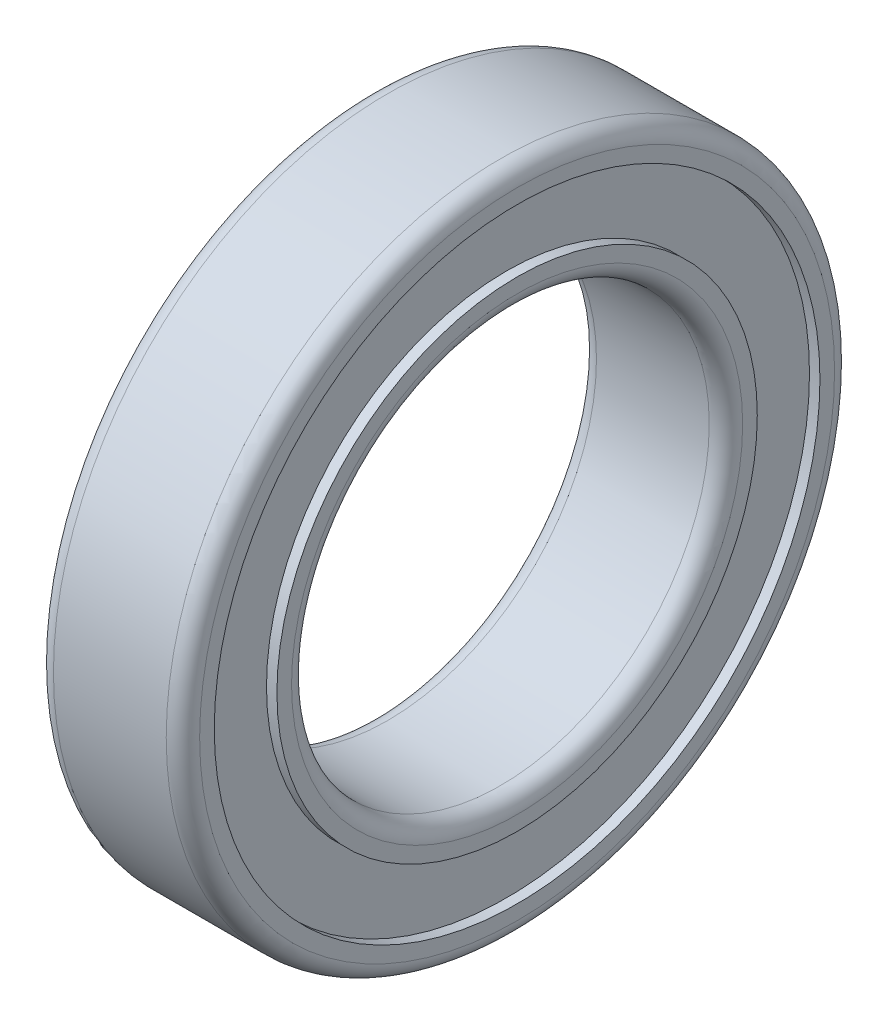
ISO-10303-21;
HEADER;
FILE_DESCRIPTION(('STEP AP214'),'2;1');
FILE_NAME('part.step','',(''),(''),'','','');
FILE_SCHEMA(('AUTOMOTIVE_DESIGN { 1 0 10303 214 1 1 1 1 }'));
ENDSEC;
DATA;
#1=APPLICATION_CONTEXT('core data for automotive mechanical design processes');
#2=APPLICATION_PROTOCOL_DEFINITION('international standard','automotive_design',2000,#1);
#3=PRODUCT_CONTEXT('',#1,'mechanical');
#4=PRODUCT('Part','Part','',(#3));
#5=PRODUCT_RELATED_PRODUCT_CATEGORY('part','',(#4));
#6=PRODUCT_DEFINITION_FORMATION('','',#4);
#7=PRODUCT_DEFINITION_CONTEXT('part definition',#1,'design');
#8=PRODUCT_DEFINITION('design','',#6,#7);
#9=PRODUCT_DEFINITION_SHAPE('','',#8);
#10=(LENGTH_UNIT() NAMED_UNIT(*) SI_UNIT(.MILLI.,.METRE.));
#11=(NAMED_UNIT(*) PLANE_ANGLE_UNIT() SI_UNIT($,.RADIAN.));
#12=(NAMED_UNIT(*) SI_UNIT($,.STERADIAN.) SOLID_ANGLE_UNIT());
#13=UNCERTAINTY_MEASURE_WITH_UNIT(LENGTH_MEASURE(1.E-05),#10,'distance_accuracy_value','');
#14=(GEOMETRIC_REPRESENTATION_CONTEXT(3) GLOBAL_UNCERTAINTY_ASSIGNED_CONTEXT((#13)) GLOBAL_UNIT_ASSIGNED_CONTEXT((#10,
#11,#12)) REPRESENTATION_CONTEXT('',''));
#15=CARTESIAN_POINT('',(0.,0.,0.));
#16=DIRECTION('',(0.,0.,1.));
#17=DIRECTION('',(1.,0.,0.));
#18=AXIS2_PLACEMENT_3D('',#15,#16,#17);
#19=CARTESIAN_POINT('',(-3.5,10.,0.));
#20=DIRECTION('',(-1.,0.,0.));
#21=DIRECTION('',(0.,0.,1.));
#22=AXIS2_PLACEMENT_3D('',#19,#20,#21);
#23=PLANE('',#22);
#24=CARTESIAN_POINT('',(-3.5,0.,0.));
#25=DIRECTION('',(-1.,0.,0.));
#26=DIRECTION('',(0.,0.,1.));
#27=AXIS2_PLACEMENT_3D('',#24,#25,#26);
#28=CIRCLE('',#27,10.8);
#29=CARTESIAN_POINT('',(-3.5,0.,10.8));
#30=VERTEX_POINT('',#29);
#31=EDGE_CURVE('E54',#30,#30,#28,.F.);
#32=ORIENTED_EDGE('',*,*,#31,.T.);
#33=EDGE_LOOP('',(#32));
#34=FACE_BOUND('',#33,.T.);
#35=CARTESIAN_POINT('',(-3.5,0.,0.));
#36=DIRECTION('',(1.,0.,0.));
#37=DIRECTION('',(0.,0.,-1.));
#38=AXIS2_PLACEMENT_3D('',#35,#36,#37);
#39=CIRCLE('',#38,11.5);
#40=CARTESIAN_POINT('',(-3.5,0.,-11.5));
#41=VERTEX_POINT('',#40);
#42=EDGE_CURVE('E92',#41,#41,#39,.T.);
#43=ORIENTED_EDGE('',*,*,#42,.F.);
#44=EDGE_LOOP('',(#43));
#45=FACE_BOUND('',#44,.T.);
#46=ADVANCED_FACE('F39',(#34,#45),#23,.T.);
#47=CARTESIAN_POINT('',(0.,0.,0.));
#48=DIRECTION('',(1.,0.,0.));
#49=DIRECTION('',(0.,0.,-1.));
#50=AXIS2_PLACEMENT_3D('',#47,#48,#49);
#51=CYLINDRICAL_SURFACE('',#50,10.);
#52=CARTESIAN_POINT('',(-2.7,0.,0.));
#53=DIRECTION('',(-1.,0.,0.));
#54=DIRECTION('',(0.,0.,1.));
#55=AXIS2_PLACEMENT_3D('',#52,#53,#54);
#56=CIRCLE('',#55,10.);
#57=CARTESIAN_POINT('',(-2.7,0.,10.));
#58=VERTEX_POINT('',#57);
#59=EDGE_CURVE('E46',#58,#58,#56,.T.);
#60=ORIENTED_EDGE('',*,*,#59,.T.);
#61=EDGE_LOOP('',(#60));
#62=FACE_BOUND('',#61,.T.);
#63=CARTESIAN_POINT('',(2.7,0.,0.));
#64=DIRECTION('',(1.,0.,0.));
#65=DIRECTION('',(0.,0.,-1.));
#66=AXIS2_PLACEMENT_3D('',#63,#64,#65);
#67=CIRCLE('',#66,10.);
#68=CARTESIAN_POINT('',(2.7,0.,-10.));
#69=VERTEX_POINT('',#68);
#70=EDGE_CURVE('E50',#69,#69,#67,.T.);
#71=ORIENTED_EDGE('',*,*,#70,.T.);
#72=EDGE_LOOP('',(#71));
#73=FACE_BOUND('',#72,.T.);
#74=ADVANCED_FACE('F100',(#62,#73),#51,.F.);
#75=CARTESIAN_POINT('',(3.5,10.,0.));
#76=DIRECTION('',(1.,0.,0.));
#77=DIRECTION('',(0.,0.,-1.));
#78=AXIS2_PLACEMENT_3D('',#75,#76,#77);
#79=PLANE('',#78);
#80=CARTESIAN_POINT('',(3.5,0.,0.));
#81=DIRECTION('',(1.,0.,0.));
#82=DIRECTION('',(0.,0.,-1.));
#83=AXIS2_PLACEMENT_3D('',#80,#81,#82);
#84=CIRCLE('',#83,10.8);
#85=CARTESIAN_POINT('',(3.5,0.,-10.8));
#86=VERTEX_POINT('',#85);
#87=EDGE_CURVE('E10',#86,#86,#84,.F.);
#88=ORIENTED_EDGE('',*,*,#87,.T.);
#89=EDGE_LOOP('',(#88));
#90=FACE_BOUND('',#89,.T.);
#91=CARTESIAN_POINT('',(3.5,0.,0.));
#92=DIRECTION('',(1.,0.,0.));
#93=DIRECTION('',(0.,0.,-1.));
#94=AXIS2_PLACEMENT_3D('',#91,#92,#93);
#95=CIRCLE('',#94,11.5);
#96=CARTESIAN_POINT('',(3.5,0.,-11.5));
#97=VERTEX_POINT('',#96);
#98=EDGE_CURVE('E71',#97,#97,#95,.T.);
#99=ORIENTED_EDGE('',*,*,#98,.T.);
#100=EDGE_LOOP('',(#99));
#101=FACE_BOUND('',#100,.T.);
#102=ADVANCED_FACE('F106',(#90,#101),#79,.T.);
#103=CARTESIAN_POINT('',(0.,0.,0.));
#104=DIRECTION('',(1.,0.,0.));
#105=DIRECTION('',(0.,0.,-1.));
#106=AXIS2_PLACEMENT_3D('',#103,#104,#105);
#107=CYLINDRICAL_SURFACE('',#106,11.5);
#108=CARTESIAN_POINT('',(3.,0.,0.));
#109=DIRECTION('',(1.,0.,0.));
#110=DIRECTION('',(0.,0.,-1.));
#111=AXIS2_PLACEMENT_3D('',#108,#109,#110);
#112=CIRCLE('',#111,11.5);
#113=CARTESIAN_POINT('',(3.,0.,-11.5));
#114=VERTEX_POINT('',#113);
#115=EDGE_CURVE('E74',#114,#114,#112,.T.);
#116=ORIENTED_EDGE('',*,*,#115,.T.);
#117=EDGE_LOOP('',(#116));
#118=FACE_BOUND('',#117,.T.);
#119=ORIENTED_EDGE('',*,*,#98,.F.);
#120=EDGE_LOOP('',(#119));
#121=FACE_BOUND('',#120,.T.);
#122=ADVANCED_FACE('F201',(#118,#121),#107,.T.);
#123=CARTESIAN_POINT('',(3.,11.5,0.));
#124=DIRECTION('',(1.,0.,0.));
#125=DIRECTION('',(0.,0.,-1.));
#126=AXIS2_PLACEMENT_3D('',#123,#124,#125);
#127=PLANE('',#126);
#128=CARTESIAN_POINT('',(3.,0.,0.));
#129=DIRECTION('',(1.,0.,0.));
#130=DIRECTION('',(0.,0.,-1.));
#131=AXIS2_PLACEMENT_3D('',#128,#129,#130);
#132=CIRCLE('',#131,14.5);
#133=CARTESIAN_POINT('',(3.,0.,-14.5));
#134=VERTEX_POINT('',#133);
#135=EDGE_CURVE('E77',#134,#134,#132,.T.);
#136=ORIENTED_EDGE('',*,*,#135,.T.);
#137=EDGE_LOOP('',(#136));
#138=FACE_BOUND('',#137,.T.);
#139=ORIENTED_EDGE('',*,*,#115,.F.);
#140=EDGE_LOOP('',(#139));
#141=FACE_BOUND('',#140,.T.);
#142=ADVANCED_FACE('F251',(#138,#141),#127,.T.);
#143=CARTESIAN_POINT('',(0.,0.,0.));
#144=DIRECTION('',(1.,0.,0.));
#145=DIRECTION('',(0.,0.,-1.));
#146=AXIS2_PLACEMENT_3D('',#143,#144,#145);
#147=CYLINDRICAL_SURFACE('',#146,14.5);
#148=CARTESIAN_POINT('',(3.5,0.,0.));
#149=DIRECTION('',(1.,0.,0.));
#150=DIRECTION('',(0.,0.,-1.));
#151=AXIS2_PLACEMENT_3D('',#148,#149,#150);
#152=CIRCLE('',#151,14.5);
#153=CARTESIAN_POINT('',(3.5,0.,-14.5));
#154=VERTEX_POINT('',#153);
#155=EDGE_CURVE('E80',#154,#154,#152,.T.);
#156=ORIENTED_EDGE('',*,*,#155,.T.);
#157=EDGE_LOOP('',(#156));
#158=FACE_BOUND('',#157,.T.);
#159=ORIENTED_EDGE('',*,*,#135,.F.);
#160=EDGE_LOOP('',(#159));
#161=FACE_BOUND('',#160,.T.);
#162=ADVANCED_FACE('F188',(#158,#161),#147,.F.);
#163=CARTESIAN_POINT('',(3.5,14.5,0.));
#164=DIRECTION('',(1.,0.,0.));
#165=DIRECTION('',(0.,0.,-1.));
#166=AXIS2_PLACEMENT_3D('',#163,#164,#165);
#167=PLANE('',#166);
#168=CARTESIAN_POINT('',(3.5,0.,0.));
#169=DIRECTION('',(1.,0.,0.));
#170=DIRECTION('',(0.,0.,-1.));
#171=AXIS2_PLACEMENT_3D('',#168,#169,#170);
#172=CIRCLE('',#171,15.2);
#173=CARTESIAN_POINT('',(3.5,0.,-15.2));
#174=VERTEX_POINT('',#173);
#175=EDGE_CURVE('E68',#174,#174,#172,.T.);
#176=ORIENTED_EDGE('',*,*,#175,.T.);
#177=EDGE_LOOP('',(#176));
#178=FACE_BOUND('',#177,.T.);
#179=ORIENTED_EDGE('',*,*,#155,.F.);
#180=EDGE_LOOP('',(#179));
#181=FACE_BOUND('',#180,.T.);
#182=ADVANCED_FACE('F177',(#178,#181),#167,.T.);
#183=CARTESIAN_POINT('',(0.,0.,0.));
#184=DIRECTION('',(1.,0.,0.));
#185=DIRECTION('',(0.,0.,-1.));
#186=AXIS2_PLACEMENT_3D('',#183,#184,#185);
#187=CYLINDRICAL_SURFACE('',#186,16.);
#188=CARTESIAN_POINT('',(2.7,0.,0.));
#189=DIRECTION('',(1.,0.,0.));
#190=DIRECTION('',(0.,0.,-1.));
#191=AXIS2_PLACEMENT_3D('',#188,#189,#190);
#192=CIRCLE('',#191,16.);
#193=CARTESIAN_POINT('',(2.7,0.,-16.));
#194=VERTEX_POINT('',#193);
#195=EDGE_CURVE('E62',#194,#194,#192,.F.);
#196=ORIENTED_EDGE('',*,*,#195,.T.);
#197=EDGE_LOOP('',(#196));
#198=FACE_BOUND('',#197,.T.);
#199=CARTESIAN_POINT('',(-2.7,0.,0.));
#200=DIRECTION('',(-1.,0.,0.));
#201=DIRECTION('',(0.,0.,1.));
#202=AXIS2_PLACEMENT_3D('',#199,#200,#201);
#203=CIRCLE('',#202,16.);
#204=CARTESIAN_POINT('',(-2.7,0.,16.));
#205=VERTEX_POINT('',#204);
#206=EDGE_CURVE('E65',#205,#205,#203,.F.);
#207=ORIENTED_EDGE('',*,*,#206,.T.);
#208=EDGE_LOOP('',(#207));
#209=FACE_BOUND('',#208,.T.);
#210=ADVANCED_FACE('F164',(#198,#209),#187,.T.);
#211=CARTESIAN_POINT('',(-3.5,14.5,0.));
#212=DIRECTION('',(-1.,0.,0.));
#213=DIRECTION('',(0.,0.,1.));
#214=AXIS2_PLACEMENT_3D('',#211,#212,#213);
#215=PLANE('',#214);
#216=CARTESIAN_POINT('',(-3.5,0.,0.));
#217=DIRECTION('',(-1.,0.,0.));
#218=DIRECTION('',(0.,0.,1.));
#219=AXIS2_PLACEMENT_3D('',#216,#217,#218);
#220=CIRCLE('',#219,15.2);
#221=CARTESIAN_POINT('',(-3.5,0.,15.2));
#222=VERTEX_POINT('',#221);
#223=EDGE_CURVE('E59',#222,#222,#220,.T.);
#224=ORIENTED_EDGE('',*,*,#223,.T.);
#225=EDGE_LOOP('',(#224));
#226=FACE_BOUND('',#225,.T.);
#227=CARTESIAN_POINT('',(-3.5,0.,0.));
#228=DIRECTION('',(1.,0.,0.));
#229=DIRECTION('',(0.,0.,-1.));
#230=AXIS2_PLACEMENT_3D('',#227,#228,#229);
#231=CIRCLE('',#230,14.5);
#232=CARTESIAN_POINT('',(-3.5,0.,-14.5));
#233=VERTEX_POINT('',#232);
#234=EDGE_CURVE('E83',#233,#233,#231,.T.);
#235=ORIENTED_EDGE('',*,*,#234,.T.);
#236=EDGE_LOOP('',(#235));
#237=FACE_BOUND('',#236,.T.);
#238=ADVANCED_FACE('F158',(#226,#237),#215,.T.);
#239=CARTESIAN_POINT('',(0.,0.,0.));
#240=DIRECTION('',(1.,0.,0.));
#241=DIRECTION('',(0.,0.,-1.));
#242=AXIS2_PLACEMENT_3D('',#239,#240,#241);
#243=CYLINDRICAL_SURFACE('',#242,14.5);
#244=CARTESIAN_POINT('',(-3.,0.,0.));
#245=DIRECTION('',(1.,0.,0.));
#246=DIRECTION('',(0.,0.,-1.));
#247=AXIS2_PLACEMENT_3D('',#244,#245,#246);
#248=CIRCLE('',#247,14.5);
#249=CARTESIAN_POINT('',(-3.,0.,-14.5));
#250=VERTEX_POINT('',#249);
#251=EDGE_CURVE('E86',#250,#250,#248,.T.);
#252=ORIENTED_EDGE('',*,*,#251,.T.);
#253=EDGE_LOOP('',(#252));
#254=FACE_BOUND('',#253,.T.);
#255=ORIENTED_EDGE('',*,*,#234,.F.);
#256=EDGE_LOOP('',(#255));
#257=FACE_BOUND('',#256,.T.);
#258=ADVANCED_FACE('F163',(#254,#257),#243,.F.);
#259=CARTESIAN_POINT('',(-3.,11.5,0.));
#260=DIRECTION('',(-1.,0.,0.));
#261=DIRECTION('',(0.,0.,1.));
#262=AXIS2_PLACEMENT_3D('',#259,#260,#261);
#263=PLANE('',#262);
#264=CARTESIAN_POINT('',(-3.,0.,0.));
#265=DIRECTION('',(1.,0.,0.));
#266=DIRECTION('',(0.,0.,-1.));
#267=AXIS2_PLACEMENT_3D('',#264,#265,#266);
#268=CIRCLE('',#267,11.5);
#269=CARTESIAN_POINT('',(-3.,0.,-11.5));
#270=VERTEX_POINT('',#269);
#271=EDGE_CURVE('E89',#270,#270,#268,.T.);
#272=ORIENTED_EDGE('',*,*,#271,.T.);
#273=EDGE_LOOP('',(#272));
#274=FACE_BOUND('',#273,.T.);
#275=ORIENTED_EDGE('',*,*,#251,.F.);
#276=EDGE_LOOP('',(#275));
#277=FACE_BOUND('',#276,.T.);
#278=ADVANCED_FACE('F222',(#274,#277),#263,.T.);
#279=CARTESIAN_POINT('',(0.,0.,0.));
#280=DIRECTION('',(1.,0.,0.));
#281=DIRECTION('',(0.,0.,-1.));
#282=AXIS2_PLACEMENT_3D('',#279,#280,#281);
#283=CYLINDRICAL_SURFACE('',#282,11.5);
#284=ORIENTED_EDGE('',*,*,#42,.T.);
#285=EDGE_LOOP('',(#284));
#286=FACE_BOUND('',#285,.T.);
#287=ORIENTED_EDGE('',*,*,#271,.F.);
#288=EDGE_LOOP('',(#287));
#289=FACE_BOUND('',#288,.T.);
#290=ADVANCED_FACE('F96',(#286,#289),#283,.T.);
#291=CARTESIAN_POINT('',(2.7,0.,0.));
#292=DIRECTION('',(1.,0.,0.));
#293=DIRECTION('',(0.,0.,-1.));
#294=AXIS2_PLACEMENT_3D('',#291,#292,#293);
#295=TOROIDAL_SURFACE('',#294,15.2,0.8);
#296=ORIENTED_EDGE('',*,*,#195,.F.);
#297=EDGE_LOOP('',(#296));
#298=FACE_BOUND('',#297,.T.);
#299=ORIENTED_EDGE('',*,*,#175,.F.);
#300=EDGE_LOOP('',(#299));
#301=FACE_BOUND('',#300,.T.);
#302=ADVANCED_FACE('F110',(#298,#301),#295,.T.);
#303=CARTESIAN_POINT('',(-2.7,0.,0.));
#304=DIRECTION('',(-1.,0.,0.));
#305=DIRECTION('',(0.,0.,1.));
#306=AXIS2_PLACEMENT_3D('',#303,#304,#305);
#307=TOROIDAL_SURFACE('',#306,15.2,0.8);
#308=ORIENTED_EDGE('',*,*,#223,.F.);
#309=EDGE_LOOP('',(#308));
#310=FACE_BOUND('',#309,.T.);
#311=ORIENTED_EDGE('',*,*,#206,.F.);
#312=EDGE_LOOP('',(#311));
#313=FACE_BOUND('',#312,.T.);
#314=ADVANCED_FACE('F113',(#310,#313),#307,.T.);
#315=CARTESIAN_POINT('',(-2.7,0.,0.));
#316=DIRECTION('',(-1.,0.,0.));
#317=DIRECTION('',(0.,0.,1.));
#318=AXIS2_PLACEMENT_3D('',#315,#316,#317);
#319=TOROIDAL_SURFACE('',#318,10.8,0.8);
#320=ORIENTED_EDGE('',*,*,#59,.F.);
#321=EDGE_LOOP('',(#320));
#322=FACE_BOUND('',#321,.T.);
#323=ORIENTED_EDGE('',*,*,#31,.F.);
#324=EDGE_LOOP('',(#323));
#325=FACE_BOUND('',#324,.T.);
#326=ADVANCED_FACE('F116',(#322,#325),#319,.T.);
#327=CARTESIAN_POINT('',(2.7,0.,0.));
#328=DIRECTION('',(1.,0.,0.));
#329=DIRECTION('',(0.,0.,-1.));
#330=AXIS2_PLACEMENT_3D('',#327,#328,#329);
#331=TOROIDAL_SURFACE('',#330,10.8,0.8);
#332=ORIENTED_EDGE('',*,*,#87,.F.);
#333=EDGE_LOOP('',(#332));
#334=FACE_BOUND('',#333,.T.);
#335=ORIENTED_EDGE('',*,*,#70,.F.);
#336=EDGE_LOOP('',(#335));
#337=FACE_BOUND('',#336,.T.);
#338=ADVANCED_FACE('F41',(#334,#337),#331,.T.);
#339=CLOSED_SHELL('',(#46,#74,#102,#122,#142,#162,#182,#210,#238,#258,#278,#290,#302,#314,#326,#338));
#340=MANIFOLD_SOLID_BREP('B2',#339);
#341=ADVANCED_BREP_SHAPE_REPRESENTATION('',(#18,#340),#14);
#342=SHAPE_DEFINITION_REPRESENTATION(#9,#341);
ENDSEC;
END-ISO-10303-21;
